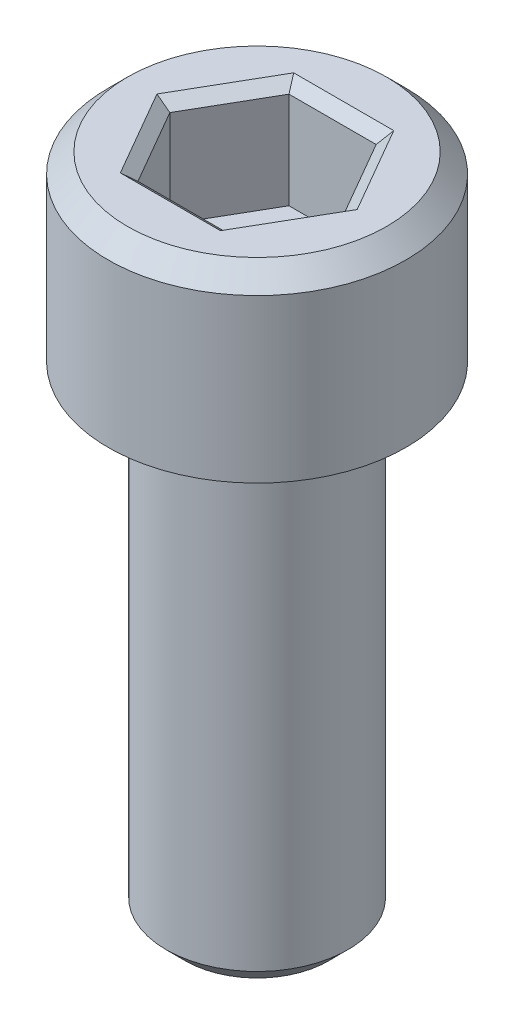
ISO-10303-21;
HEADER;
FILE_DESCRIPTION(('STEP AP214'),'2;1');
FILE_NAME('part.step','',(''),(''),'','','');
FILE_SCHEMA(('AUTOMOTIVE_DESIGN { 1 0 10303 214 1 1 1 1 }'));
ENDSEC;
DATA;
#1=APPLICATION_CONTEXT('core data for automotive mechanical design processes');
#2=APPLICATION_PROTOCOL_DEFINITION('international standard','automotive_design',2000,#1);
#3=PRODUCT_CONTEXT('',#1,'mechanical');
#4=PRODUCT('Part','Part','',(#3));
#5=PRODUCT_RELATED_PRODUCT_CATEGORY('part','',(#4));
#6=PRODUCT_DEFINITION_FORMATION('','',#4);
#7=PRODUCT_DEFINITION_CONTEXT('part definition',#1,'design');
#8=PRODUCT_DEFINITION('design','',#6,#7);
#9=PRODUCT_DEFINITION_SHAPE('','',#8);
#10=(LENGTH_UNIT() NAMED_UNIT(*) SI_UNIT(.MILLI.,.METRE.));
#11=(NAMED_UNIT(*) PLANE_ANGLE_UNIT() SI_UNIT($,.RADIAN.));
#12=(NAMED_UNIT(*) SI_UNIT($,.STERADIAN.) SOLID_ANGLE_UNIT());
#13=UNCERTAINTY_MEASURE_WITH_UNIT(LENGTH_MEASURE(1.E-05),#10,'distance_accuracy_value','');
#14=(GEOMETRIC_REPRESENTATION_CONTEXT(3) GLOBAL_UNCERTAINTY_ASSIGNED_CONTEXT((#13)) GLOBAL_UNIT_ASSIGNED_CONTEXT((#10,
#11,#12)) REPRESENTATION_CONTEXT('',''));
#15=CARTESIAN_POINT('',(0.,0.,0.));
#16=DIRECTION('',(0.,0.,1.));
#17=DIRECTION('',(1.,0.,0.));
#18=AXIS2_PLACEMENT_3D('',#15,#16,#17);
#19=CARTESIAN_POINT('',(-2.3876,0.,0.));
#20=DIRECTION('',(0.,1.,0.));
#21=DIRECTION('',(0.,0.,1.));
#22=AXIS2_PLACEMENT_3D('',#19,#20,#21);
#23=PLANE('',#22);
#24=CARTESIAN_POINT('',(0.,0.,0.));
#25=DIRECTION('',(0.,1.,0.));
#26=DIRECTION('',(0.,0.,1.));
#27=AXIS2_PLACEMENT_3D('',#24,#25,#26);
#28=CIRCLE('',#27,1.8796);
#29=CARTESIAN_POINT('',(0.,0.,1.8796));
#30=VERTEX_POINT('',#29);
#31=EDGE_CURVE('E167',#30,#30,#28,.F.);
#32=ORIENTED_EDGE('',*,*,#31,.T.);
#33=EDGE_LOOP('',(#32));
#34=FACE_BOUND('',#33,.T.);
#35=ADVANCED_FACE('F38',(#34),#23,.F.);
#36=CARTESIAN_POINT('',(0.,17.4752,0.));
#37=DIRECTION('',(0.,-1.,0.));
#38=DIRECTION('',(0.,0.,-1.));
#39=AXIS2_PLACEMENT_3D('',#36,#37,#38);
#40=PLANE('',#39);
#41=DIRECTION('',(0.5,0.,-0.866025403784439));
#42=VECTOR('',#41,1.);
#43=CARTESIAN_POINT('',(-1.97251955281603,17.4752,-1.13883469480014));
#44=LINE('',#43,#42);
#45=CARTESIAN_POINT('',(-2.63002607042138,17.4752,0.));
#46=VERTEX_POINT('',#45);
#47=CARTESIAN_POINT('',(-1.31501303521069,17.4752,-2.27766938960027));
#48=VERTEX_POINT('',#47);
#49=EDGE_CURVE('E178',#46,#48,#44,.T.);
#50=ORIENTED_EDGE('',*,*,#49,.T.);
#51=DIRECTION('',(1.,0.,0.));
#52=VECTOR('',#51,1.);
#53=CARTESIAN_POINT('',(0.,17.4752,-2.27766938960027));
#54=LINE('',#53,#52);
#55=CARTESIAN_POINT('',(1.31501303521069,17.4752,-2.27766938960027));
#56=VERTEX_POINT('',#55);
#57=EDGE_CURVE('E186',#48,#56,#54,.T.);
#58=ORIENTED_EDGE('',*,*,#57,.T.);
#59=DIRECTION('',(0.5,0.,0.866025403784439));
#60=VECTOR('',#59,1.);
#61=CARTESIAN_POINT('',(1.97251955281603,17.4752,-1.13883469480014));
#62=LINE('',#61,#60);
#63=CARTESIAN_POINT('',(2.63002607042137,17.4752,0.));
#64=VERTEX_POINT('',#63);
#65=EDGE_CURVE('E184',#56,#64,#62,.T.);
#66=ORIENTED_EDGE('',*,*,#65,.T.);
#67=DIRECTION('',(-0.5,0.,0.866025403784439));
#68=VECTOR('',#67,1.);
#69=CARTESIAN_POINT('',(1.97251955281603,17.4752,1.13883469480014));
#70=LINE('',#69,#68);
#71=CARTESIAN_POINT('',(1.31501303521069,17.4752,2.27766938960027));
#72=VERTEX_POINT('',#71);
#73=EDGE_CURVE('E182',#64,#72,#70,.T.);
#74=ORIENTED_EDGE('',*,*,#73,.T.);
#75=DIRECTION('',(-1.,0.,0.));
#76=VECTOR('',#75,1.);
#77=CARTESIAN_POINT('',(0.,17.4752,2.27766938960027));
#78=LINE('',#77,#76);
#79=CARTESIAN_POINT('',(-1.31501303521069,17.4752,2.27766938960027));
#80=VERTEX_POINT('',#79);
#81=EDGE_CURVE('E180',#72,#80,#78,.T.);
#82=ORIENTED_EDGE('',*,*,#81,.T.);
#83=DIRECTION('',(-0.5,0.,-0.866025403784439));
#84=VECTOR('',#83,1.);
#85=CARTESIAN_POINT('',(-1.97251955281603,17.4752,1.13883469480014));
#86=LINE('',#85,#84);
#87=EDGE_CURVE('E176',#80,#46,#86,.T.);
#88=ORIENTED_EDGE('',*,*,#87,.T.);
#89=EDGE_LOOP('',(#50,#58,#66,#74,#82,#88));
#90=FACE_BOUND('',#89,.T.);
#91=CARTESIAN_POINT('',(0.,17.4752,0.));
#92=DIRECTION('',(0.,-1.,0.));
#93=DIRECTION('',(0.,0.,-1.));
#94=AXIS2_PLACEMENT_3D('',#91,#92,#93);
#95=CIRCLE('',#94,3.4036);
#96=CARTESIAN_POINT('',(0.,17.4752,-3.4036));
#97=VERTEX_POINT('',#96);
#98=EDGE_CURVE('E164',#97,#97,#95,.F.);
#99=ORIENTED_EDGE('',*,*,#98,.T.);
#100=EDGE_LOOP('',(#99));
#101=FACE_BOUND('',#100,.T.);
#102=ADVANCED_FACE('F233',(#90,#101),#40,.F.);
#103=CARTESIAN_POINT('',(0.,0.,0.));
#104=DIRECTION('',(0.,-1.,0.));
#105=DIRECTION('',(0.,0.,-1.));
#106=AXIS2_PLACEMENT_3D('',#103,#104,#105);
#107=CYLINDRICAL_SURFACE('',#106,3.9116);
#108=CARTESIAN_POINT('',(0.,16.9672,0.));
#109=DIRECTION('',(0.,-1.,0.));
#110=DIRECTION('',(0.,0.,-1.));
#111=AXIS2_PLACEMENT_3D('',#108,#109,#110);
#112=CIRCLE('',#111,3.9116);
#113=CARTESIAN_POINT('',(0.,16.9672,-3.9116));
#114=VERTEX_POINT('',#113);
#115=EDGE_CURVE('E161',#114,#114,#112,.T.);
#116=ORIENTED_EDGE('',*,*,#115,.T.);
#117=EDGE_LOOP('',(#116));
#118=FACE_BOUND('',#117,.T.);
#119=CARTESIAN_POINT('',(0.,12.7,0.));
#120=DIRECTION('',(0.,-1.,0.));
#121=DIRECTION('',(0.,0.,-1.));
#122=AXIS2_PLACEMENT_3D('',#119,#120,#121);
#123=CIRCLE('',#122,3.9116);
#124=CARTESIAN_POINT('',(0.,12.7,-3.9116));
#125=VERTEX_POINT('',#124);
#126=EDGE_CURVE('E158',#125,#125,#123,.T.);
#127=ORIENTED_EDGE('',*,*,#126,.F.);
#128=EDGE_LOOP('',(#127));
#129=FACE_BOUND('',#128,.T.);
#130=ADVANCED_FACE('F255',(#118,#129),#107,.T.);
#131=CARTESIAN_POINT('',(-3.9116,12.7,0.));
#132=DIRECTION('',(0.,1.,0.));
#133=DIRECTION('',(0.,0.,1.));
#134=AXIS2_PLACEMENT_3D('',#131,#132,#133);
#135=PLANE('',#134);
#136=CARTESIAN_POINT('',(0.,12.7,0.));
#137=DIRECTION('',(0.,-1.,0.));
#138=DIRECTION('',(0.,0.,-1.));
#139=AXIS2_PLACEMENT_3D('',#136,#137,#138);
#140=CIRCLE('',#139,2.3876);
#141=CARTESIAN_POINT('',(0.,12.7,-2.3876));
#142=VERTEX_POINT('',#141);
#143=EDGE_CURVE('E148',#142,#142,#140,.T.);
#144=ORIENTED_EDGE('',*,*,#143,.F.);
#145=EDGE_LOOP('',(#144));
#146=FACE_BOUND('',#145,.T.);
#147=ORIENTED_EDGE('',*,*,#126,.T.);
#148=EDGE_LOOP('',(#147));
#149=FACE_BOUND('',#148,.T.);
#150=ADVANCED_FACE('F379',(#146,#149),#135,.F.);
#151=CARTESIAN_POINT('',(0.,0.,0.));
#152=DIRECTION('',(0.,-1.,0.));
#153=DIRECTION('',(0.,0.,-1.));
#154=AXIS2_PLACEMENT_3D('',#151,#152,#153);
#155=CYLINDRICAL_SURFACE('',#154,2.3876);
#156=CARTESIAN_POINT('',(0.,0.508000000000002,0.));
#157=DIRECTION('',(0.,1.,0.));
#158=DIRECTION('',(0.,0.,1.));
#159=AXIS2_PLACEMENT_3D('',#156,#157,#158);
#160=CIRCLE('',#159,2.3876);
#161=CARTESIAN_POINT('',(0.,0.508000000000002,2.3876));
#162=VERTEX_POINT('',#161);
#163=EDGE_CURVE('E170',#162,#162,#160,.T.);
#164=ORIENTED_EDGE('',*,*,#163,.T.);
#165=EDGE_LOOP('',(#164));
#166=FACE_BOUND('',#165,.T.);
#167=ORIENTED_EDGE('',*,*,#143,.T.);
#168=EDGE_LOOP('',(#167));
#169=FACE_BOUND('',#168,.T.);
#170=ADVANCED_FACE('F350',(#166,#169),#155,.T.);
#171=CARTESIAN_POINT('',(1.1456797,14.6812,1.98437544960027));
#172=DIRECTION('',(0.866025403784439,0.,0.5));
#173=DIRECTION('',(0.5,0.,-0.866025403784439));
#174=AXIS2_PLACEMENT_3D('',#171,#172,#173);
#175=PLANE('',#174);
#176=DIRECTION('',(0.,1.,0.));
#177=VECTOR('',#176,1.);
#178=CARTESIAN_POINT('',(1.1456797,14.6812,1.98437544960027));
#179=LINE('',#178,#177);
#180=CARTESIAN_POINT('',(1.1456797,14.6812,1.98437544960027));
#181=VERTEX_POINT('',#180);
#182=CARTESIAN_POINT('',(1.1456797,17.2212000388316,1.98437544960027));
#183=VERTEX_POINT('',#182);
#184=EDGE_CURVE('E146',#181,#183,#179,.T.);
#185=ORIENTED_EDGE('',*,*,#184,.T.);
#186=DIRECTION('',(0.5,0.,-0.866025403784439));
#187=VECTOR('',#186,1.);
#188=CARTESIAN_POINT('',(1.1456797,17.2212000388316,1.98437544960027));
#189=LINE('',#188,#187);
#190=CARTESIAN_POINT('',(2.2913594,17.2212000388316,0.));
#191=VERTEX_POINT('',#190);
#192=EDGE_CURVE('E117',#183,#191,#189,.T.);
#193=ORIENTED_EDGE('',*,*,#192,.T.);
#194=DIRECTION('',(0.,1.,0.));
#195=VECTOR('',#194,1.);
#196=CARTESIAN_POINT('',(2.2913594,14.6812,0.));
#197=LINE('',#196,#195);
#198=CARTESIAN_POINT('',(2.2913594,14.6812,0.));
#199=VERTEX_POINT('',#198);
#200=EDGE_CURVE('E109',#199,#191,#197,.T.);
#201=ORIENTED_EDGE('',*,*,#200,.F.);
#202=DIRECTION('',(0.5,0.,-0.866025403784439));
#203=VECTOR('',#202,1.);
#204=CARTESIAN_POINT('',(1.1456797,14.6812,1.98437544960027));
#205=LINE('',#204,#203);
#206=EDGE_CURVE('E114',#181,#199,#205,.T.);
#207=ORIENTED_EDGE('',*,*,#206,.F.);
#208=EDGE_LOOP('',(#185,#193,#201,#207));
#209=FACE_BOUND('',#208,.T.);
#210=ADVANCED_FACE('F112',(#209),#175,.F.);
#211=CARTESIAN_POINT('',(-1.1456797,14.6812,1.98437544960027));
#212=DIRECTION('',(0.,0.,1.));
#213=DIRECTION('',(1.,0.,0.));
#214=AXIS2_PLACEMENT_3D('',#211,#212,#213);
#215=PLANE('',#214);
#216=DIRECTION('',(0.,1.,0.));
#217=VECTOR('',#216,1.);
#218=CARTESIAN_POINT('',(-1.1456797,14.6812,1.98437544960027));
#219=LINE('',#218,#217);
#220=CARTESIAN_POINT('',(-1.1456797,14.6812,1.98437544960027));
#221=VERTEX_POINT('',#220);
#222=CARTESIAN_POINT('',(-1.1456797,17.2212000388316,1.98437544960027));
#223=VERTEX_POINT('',#222);
#224=EDGE_CURVE('E149',#221,#223,#219,.T.);
#225=ORIENTED_EDGE('',*,*,#224,.T.);
#226=DIRECTION('',(1.,0.,0.));
#227=VECTOR('',#226,1.);
#228=CARTESIAN_POINT('',(-1.1456797,17.2212000388316,1.98437544960027));
#229=LINE('',#228,#227);
#230=EDGE_CURVE('E192',#223,#183,#229,.T.);
#231=ORIENTED_EDGE('',*,*,#230,.T.);
#232=ORIENTED_EDGE('',*,*,#184,.F.);
#233=DIRECTION('',(1.,0.,0.));
#234=VECTOR('',#233,1.);
#235=CARTESIAN_POINT('',(-1.1456797,14.6812,1.98437544960027));
#236=LINE('',#235,#234);
#237=EDGE_CURVE('E121',#221,#181,#236,.T.);
#238=ORIENTED_EDGE('',*,*,#237,.F.);
#239=EDGE_LOOP('',(#225,#231,#232,#238));
#240=FACE_BOUND('',#239,.T.);
#241=ADVANCED_FACE('F215',(#240),#215,.F.);
#242=CARTESIAN_POINT('',(-2.2913594,14.6812,0.));
#243=DIRECTION('',(-0.866025403784439,0.,0.5));
#244=DIRECTION('',(0.5,0.,0.866025403784439));
#245=AXIS2_PLACEMENT_3D('',#242,#243,#244);
#246=PLANE('',#245);
#247=DIRECTION('',(0.,1.,0.));
#248=VECTOR('',#247,1.);
#249=CARTESIAN_POINT('',(-2.2913594,14.6812,0.));
#250=LINE('',#249,#248);
#251=CARTESIAN_POINT('',(-2.2913594,14.6812,0.));
#252=VERTEX_POINT('',#251);
#253=CARTESIAN_POINT('',(-2.2913594,17.2212000388316,0.));
#254=VERTEX_POINT('',#253);
#255=EDGE_CURVE('E151',#252,#254,#250,.T.);
#256=ORIENTED_EDGE('',*,*,#255,.T.);
#257=DIRECTION('',(0.5,0.,0.866025403784439));
#258=VECTOR('',#257,1.);
#259=CARTESIAN_POINT('',(-2.2913594,17.2212000388316,0.));
#260=LINE('',#259,#258);
#261=EDGE_CURVE('E11',#254,#223,#260,.T.);
#262=ORIENTED_EDGE('',*,*,#261,.T.);
#263=ORIENTED_EDGE('',*,*,#224,.F.);
#264=DIRECTION('',(0.5,0.,0.866025403784439));
#265=VECTOR('',#264,1.);
#266=CARTESIAN_POINT('',(-2.2913594,14.6812,0.));
#267=LINE('',#266,#265);
#268=EDGE_CURVE('E143',#252,#221,#267,.T.);
#269=ORIENTED_EDGE('',*,*,#268,.F.);
#270=EDGE_LOOP('',(#256,#262,#263,#269));
#271=FACE_BOUND('',#270,.T.);
#272=ADVANCED_FACE('F217',(#271),#246,.F.);
#273=CARTESIAN_POINT('',(-1.1456797,14.6812,-1.98437544960027));
#274=DIRECTION('',(-0.866025403784439,0.,-0.5));
#275=DIRECTION('',(-0.5,0.,0.866025403784439));
#276=AXIS2_PLACEMENT_3D('',#273,#274,#275);
#277=PLANE('',#276);
#278=DIRECTION('',(0.,1.,0.));
#279=VECTOR('',#278,1.);
#280=CARTESIAN_POINT('',(-1.1456797,14.6812,-1.98437544960027));
#281=LINE('',#280,#279);
#282=CARTESIAN_POINT('',(-1.1456797,14.6812,-1.98437544960027));
#283=VERTEX_POINT('',#282);
#284=CARTESIAN_POINT('',(-1.1456797,17.2212000388316,-1.98437544960027));
#285=VERTEX_POINT('',#284);
#286=EDGE_CURVE('E153',#283,#285,#281,.T.);
#287=ORIENTED_EDGE('',*,*,#286,.T.);
#288=DIRECTION('',(-0.5,0.,0.866025403784439));
#289=VECTOR('',#288,1.);
#290=CARTESIAN_POINT('',(-1.1456797,17.2212000388316,-1.98437544960027));
#291=LINE('',#290,#289);
#292=EDGE_CURVE('E47',#285,#254,#291,.T.);
#293=ORIENTED_EDGE('',*,*,#292,.T.);
#294=ORIENTED_EDGE('',*,*,#255,.F.);
#295=DIRECTION('',(-0.5,0.,0.866025403784439));
#296=VECTOR('',#295,1.);
#297=CARTESIAN_POINT('',(-1.1456797,14.6812,-1.98437544960027));
#298=LINE('',#297,#296);
#299=EDGE_CURVE('E140',#283,#252,#298,.T.);
#300=ORIENTED_EDGE('',*,*,#299,.F.);
#301=EDGE_LOOP('',(#287,#293,#294,#300));
#302=FACE_BOUND('',#301,.T.);
#303=ADVANCED_FACE('F219',(#302),#277,.F.);
#304=CARTESIAN_POINT('',(1.1456797,14.6812,-1.98437544960027));
#305=DIRECTION('',(0.,0.,-1.));
#306=DIRECTION('',(-1.,0.,0.));
#307=AXIS2_PLACEMENT_3D('',#304,#305,#306);
#308=PLANE('',#307);
#309=DIRECTION('',(0.,1.,0.));
#310=VECTOR('',#309,1.);
#311=CARTESIAN_POINT('',(1.1456797,14.6812,-1.98437544960027));
#312=LINE('',#311,#310);
#313=CARTESIAN_POINT('',(1.1456797,14.6812,-1.98437544960027));
#314=VERTEX_POINT('',#313);
#315=CARTESIAN_POINT('',(1.1456797,17.2212000388316,-1.98437544960027));
#316=VERTEX_POINT('',#315);
#317=EDGE_CURVE('E120',#314,#316,#312,.T.);
#318=ORIENTED_EDGE('',*,*,#317,.T.);
#319=DIRECTION('',(-1.,0.,0.));
#320=VECTOR('',#319,1.);
#321=CARTESIAN_POINT('',(1.1456797,17.2212000388316,-1.98437544960027));
#322=LINE('',#321,#320);
#323=EDGE_CURVE('E173',#316,#285,#322,.T.);
#324=ORIENTED_EDGE('',*,*,#323,.T.);
#325=ORIENTED_EDGE('',*,*,#286,.F.);
#326=DIRECTION('',(-1.,0.,0.));
#327=VECTOR('',#326,1.);
#328=CARTESIAN_POINT('',(1.1456797,14.6812,-1.98437544960027));
#329=LINE('',#328,#327);
#330=EDGE_CURVE('E130',#314,#283,#329,.T.);
#331=ORIENTED_EDGE('',*,*,#330,.F.);
#332=EDGE_LOOP('',(#318,#324,#325,#331));
#333=FACE_BOUND('',#332,.T.);
#334=ADVANCED_FACE('F221',(#333),#308,.F.);
#335=CARTESIAN_POINT('',(2.2913594,14.6812,0.));
#336=DIRECTION('',(0.866025403784438,0.,-0.5));
#337=DIRECTION('',(-0.5,0.,-0.866025403784438));
#338=AXIS2_PLACEMENT_3D('',#335,#336,#337);
#339=PLANE('',#338);
#340=ORIENTED_EDGE('',*,*,#200,.T.);
#341=DIRECTION('',(-0.5,0.,-0.866025403784438));
#342=VECTOR('',#341,1.);
#343=CARTESIAN_POINT('',(2.2913594,17.2212000388316,0.));
#344=LINE('',#343,#342);
#345=EDGE_CURVE('E189',#191,#316,#344,.T.);
#346=ORIENTED_EDGE('',*,*,#345,.T.);
#347=ORIENTED_EDGE('',*,*,#317,.F.);
#348=DIRECTION('',(-0.5,0.,-0.866025403784438));
#349=VECTOR('',#348,1.);
#350=CARTESIAN_POINT('',(2.2913594,14.6812,0.));
#351=LINE('',#350,#349);
#352=EDGE_CURVE('E124',#199,#314,#351,.T.);
#353=ORIENTED_EDGE('',*,*,#352,.F.);
#354=EDGE_LOOP('',(#340,#346,#347,#353));
#355=FACE_BOUND('',#354,.T.);
#356=ADVANCED_FACE('F125',(#355),#339,.F.);
#357=CARTESIAN_POINT('',(2.2913594,14.6812,0.));
#358=DIRECTION('',(0.,1.,0.));
#359=DIRECTION('',(0.,0.,1.));
#360=AXIS2_PLACEMENT_3D('',#357,#358,#359);
#361=PLANE('',#360);
#362=ORIENTED_EDGE('',*,*,#206,.T.);
#363=ORIENTED_EDGE('',*,*,#352,.T.);
#364=ORIENTED_EDGE('',*,*,#330,.T.);
#365=ORIENTED_EDGE('',*,*,#299,.T.);
#366=ORIENTED_EDGE('',*,*,#268,.T.);
#367=ORIENTED_EDGE('',*,*,#237,.T.);
#368=EDGE_LOOP('',(#362,#363,#364,#365,#366,#367));
#369=FACE_BOUND('',#368,.T.);
#370=ADVANCED_FACE('F132',(#369),#361,.T.);
#371=CARTESIAN_POINT('',(0.,16.9672,0.));
#372=DIRECTION('',(0.,-1.,0.));
#373=DIRECTION('',(0.,0.,-1.));
#374=AXIS2_PLACEMENT_3D('',#371,#372,#373);
#375=CONICAL_SURFACE('',#374,3.9116,0.785398163397452);
#376=ORIENTED_EDGE('',*,*,#98,.F.);
#377=EDGE_LOOP('',(#376));
#378=FACE_BOUND('',#377,.T.);
#379=ORIENTED_EDGE('',*,*,#115,.F.);
#380=EDGE_LOOP('',(#379));
#381=FACE_BOUND('',#380,.T.);
#382=ADVANCED_FACE('F259',(#378,#381),#375,.T.);
#383=CARTESIAN_POINT('',(0.,0.,0.));
#384=DIRECTION('',(0.,1.,0.));
#385=DIRECTION('',(0.,0.,1.));
#386=AXIS2_PLACEMENT_3D('',#383,#384,#385);
#387=CONICAL_SURFACE('',#386,1.8796,0.785398163397449);
#388=ORIENTED_EDGE('',*,*,#163,.F.);
#389=EDGE_LOOP('',(#388));
#390=FACE_BOUND('',#389,.T.);
#391=ORIENTED_EDGE('',*,*,#31,.F.);
#392=EDGE_LOOP('',(#391));
#393=FACE_BOUND('',#392,.T.);
#394=ADVANCED_FACE('F262',(#390,#393),#387,.T.);
#395=CARTESIAN_POINT('',(-1.1456797,17.2212000388316,1.98437544960027));
#396=DIRECTION('',(0.,-0.755928999138778,0.654653609369906));
#397=DIRECTION('',(0.,-0.654653609369906,-0.755928999138778));
#398=AXIS2_PLACEMENT_3D('',#395,#396,#397);
#399=PLANE('',#398);
#400=DIRECTION('',(0.400000023611253,-0.599999937036657,-0.692820363923438));
#401=VECTOR('',#400,1.);
#402=CARTESIAN_POINT('',(-1.1456797,17.2212000388316,1.98437544960027));
#403=LINE('',#402,#401);
#404=EDGE_CURVE('E137',#80,#223,#403,.T.);
#405=ORIENTED_EDGE('',*,*,#404,.F.);
#406=ORIENTED_EDGE('',*,*,#81,.F.);
#407=DIRECTION('',(-0.400000023611252,-0.599999937036657,-0.692820363923438));
#408=VECTOR('',#407,1.);
#409=CARTESIAN_POINT('',(1.1456797,17.2212000388316,1.98437544960027));
#410=LINE('',#409,#408);
#411=EDGE_CURVE('E42',#183,#72,#410,.F.);
#412=ORIENTED_EDGE('',*,*,#411,.F.);
#413=ORIENTED_EDGE('',*,*,#230,.F.);
#414=EDGE_LOOP('',(#405,#406,#412,#413));
#415=FACE_BOUND('',#414,.T.);
#416=ADVANCED_FACE('F40',(#415),#399,.F.);
#417=CARTESIAN_POINT('',(1.1456797,17.2212000388316,1.98437544960027));
#418=DIRECTION('',(0.566946656393512,-0.755928999138778,0.327326804684953));
#419=DIRECTION('',(0.800000047222503,0.599999937036657,0.));
#420=AXIS2_PLACEMENT_3D('',#417,#418,#419);
#421=PLANE('',#420);
#422=ORIENTED_EDGE('',*,*,#411,.T.);
#423=ORIENTED_EDGE('',*,*,#73,.F.);
#424=DIRECTION('',(-0.800000047222503,-0.599999937036657,0.));
#425=VECTOR('',#424,1.);
#426=CARTESIAN_POINT('',(2.2913594,17.2212000388316,0.));
#427=LINE('',#426,#425);
#428=EDGE_CURVE('E202',#191,#64,#427,.F.);
#429=ORIENTED_EDGE('',*,*,#428,.F.);
#430=ORIENTED_EDGE('',*,*,#192,.F.);
#431=EDGE_LOOP('',(#422,#423,#429,#430));
#432=FACE_BOUND('',#431,.T.);
#433=ADVANCED_FACE('F237',(#432),#421,.F.);
#434=CARTESIAN_POINT('',(-2.2913594,17.2212000388316,0.));
#435=DIRECTION('',(-0.566946656393512,-0.755928999138779,0.327326804684952));
#436=DIRECTION('',(0.800000047222504,-0.599999937036656,0.));
#437=AXIS2_PLACEMENT_3D('',#434,#435,#436);
#438=PLANE('',#437);
#439=ORIENTED_EDGE('',*,*,#404,.T.);
#440=ORIENTED_EDGE('',*,*,#261,.F.);
#441=DIRECTION('',(-0.800000047222504,0.599999937036657,0.));
#442=VECTOR('',#441,1.);
#443=CARTESIAN_POINT('',(-1.55812430543701,16.6712738080791,0.));
#444=LINE('',#443,#442);
#445=EDGE_CURVE('E199',#46,#254,#444,.F.);
#446=ORIENTED_EDGE('',*,*,#445,.F.);
#447=ORIENTED_EDGE('',*,*,#87,.F.);
#448=EDGE_LOOP('',(#439,#440,#446,#447));
#449=FACE_BOUND('',#448,.T.);
#450=ADVANCED_FACE('F208',(#449),#438,.F.);
#451=CARTESIAN_POINT('',(2.2913594,17.2212000388316,0.));
#452=DIRECTION('',(0.566946656393512,-0.755928999138778,-0.327326804684953));
#453=DIRECTION('',(0.800000047222503,0.599999937036657,0.));
#454=AXIS2_PLACEMENT_3D('',#451,#452,#453);
#455=PLANE('',#454);
#456=ORIENTED_EDGE('',*,*,#428,.T.);
#457=ORIENTED_EDGE('',*,*,#65,.F.);
#458=DIRECTION('',(-0.400000023611252,-0.599999937036657,0.692820363923438));
#459=VECTOR('',#458,1.);
#460=CARTESIAN_POINT('',(1.1456797,17.2212000388316,-1.98437544960027));
#461=LINE('',#460,#459);
#462=EDGE_CURVE('E197',#316,#56,#461,.F.);
#463=ORIENTED_EDGE('',*,*,#462,.F.);
#464=ORIENTED_EDGE('',*,*,#345,.F.);
#465=EDGE_LOOP('',(#456,#457,#463,#464));
#466=FACE_BOUND('',#465,.T.);
#467=ADVANCED_FACE('F240',(#466),#455,.F.);
#468=CARTESIAN_POINT('',(-1.1456797,17.2212000388316,-1.98437544960027));
#469=DIRECTION('',(-0.566946656393512,-0.755928999138779,-0.327326804684952));
#470=DIRECTION('',(0.800000047222503,-0.599999937036657,0.));
#471=AXIS2_PLACEMENT_3D('',#468,#469,#470);
#472=PLANE('',#471);
#473=ORIENTED_EDGE('',*,*,#445,.T.);
#474=ORIENTED_EDGE('',*,*,#292,.F.);
#475=DIRECTION('',(-0.400000023611253,0.599999937036657,-0.692820363923438));
#476=VECTOR('',#475,1.);
#477=CARTESIAN_POINT('',(-0.779062152718507,16.6712738080791,-1.34937523076244));
#478=LINE('',#477,#476);
#479=EDGE_CURVE('E195',#48,#285,#478,.F.);
#480=ORIENTED_EDGE('',*,*,#479,.F.);
#481=ORIENTED_EDGE('',*,*,#49,.F.);
#482=EDGE_LOOP('',(#473,#474,#480,#481));
#483=FACE_BOUND('',#482,.T.);
#484=ADVANCED_FACE('F231',(#483),#472,.F.);
#485=CARTESIAN_POINT('',(1.1456797,17.2212000388316,-1.98437544960027));
#486=DIRECTION('',(0.,-0.755928999138778,-0.654653609369906));
#487=DIRECTION('',(0.,0.654653609369906,-0.755928999138778));
#488=AXIS2_PLACEMENT_3D('',#485,#486,#487);
#489=PLANE('',#488);
#490=ORIENTED_EDGE('',*,*,#462,.T.);
#491=ORIENTED_EDGE('',*,*,#57,.F.);
#492=ORIENTED_EDGE('',*,*,#479,.T.);
#493=ORIENTED_EDGE('',*,*,#323,.F.);
#494=EDGE_LOOP('',(#490,#491,#492,#493));
#495=FACE_BOUND('',#494,.T.);
#496=ADVANCED_FACE('F225',(#495),#489,.F.);
#497=CLOSED_SHELL('',(#35,#102,#130,#150,#170,#210,#241,#272,#303,#334,#356,#370,#382,#394,#416,
#433,#450,#467,#484,#496));
#498=MANIFOLD_SOLID_BREP('B2',#497);
#499=ADVANCED_BREP_SHAPE_REPRESENTATION('',(#18,#498),#14);
#500=SHAPE_DEFINITION_REPRESENTATION(#9,#499);
ENDSEC;
END-ISO-10303-21;
